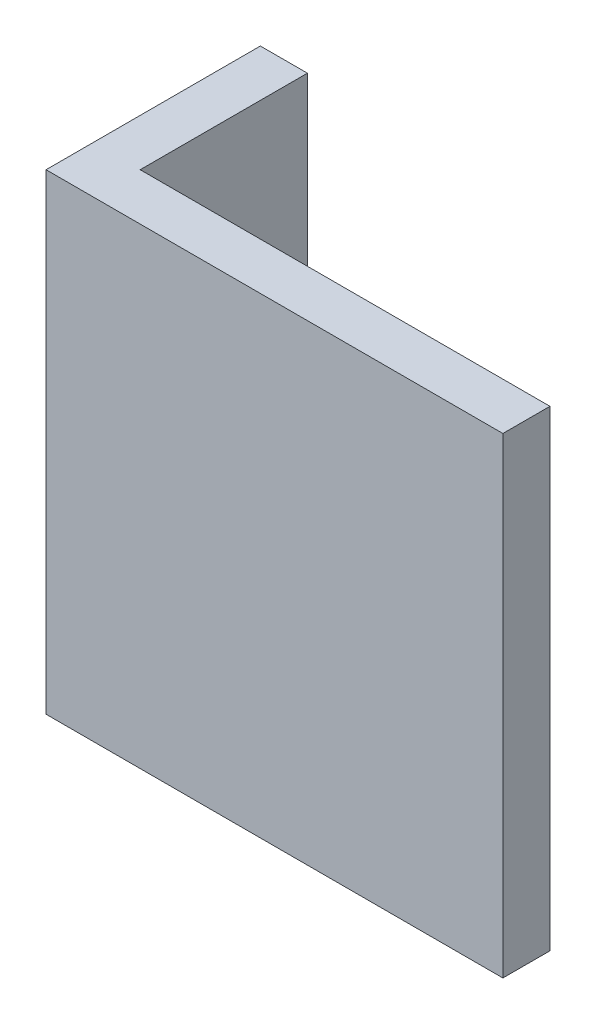
ISO-10303-21;
HEADER;
FILE_DESCRIPTION(('STEP AP214'),'2;1');
FILE_NAME('part.step','',(''),(''),'','','');
FILE_SCHEMA(('AUTOMOTIVE_DESIGN { 1 0 10303 214 1 1 1 1 }'));
ENDSEC;
DATA;
#1=APPLICATION_CONTEXT('core data for automotive mechanical design processes');
#2=APPLICATION_PROTOCOL_DEFINITION('international standard','automotive_design',2000,#1);
#3=PRODUCT_CONTEXT('',#1,'mechanical');
#4=PRODUCT('Part','Part','',(#3));
#5=PRODUCT_RELATED_PRODUCT_CATEGORY('part','',(#4));
#6=PRODUCT_DEFINITION_FORMATION('','',#4);
#7=PRODUCT_DEFINITION_CONTEXT('part definition',#1,'design');
#8=PRODUCT_DEFINITION('design','',#6,#7);
#9=PRODUCT_DEFINITION_SHAPE('','',#8);
#10=(LENGTH_UNIT() NAMED_UNIT(*) SI_UNIT(.MILLI.,.METRE.));
#11=(NAMED_UNIT(*) PLANE_ANGLE_UNIT() SI_UNIT($,.RADIAN.));
#12=(NAMED_UNIT(*) SI_UNIT($,.STERADIAN.) SOLID_ANGLE_UNIT());
#13=UNCERTAINTY_MEASURE_WITH_UNIT(LENGTH_MEASURE(1.E-05),#10,'distance_accuracy_value','');
#14=(GEOMETRIC_REPRESENTATION_CONTEXT(3) GLOBAL_UNCERTAINTY_ASSIGNED_CONTEXT((#13)) GLOBAL_UNIT_ASSIGNED_CONTEXT((#10,
#11,#12)) REPRESENTATION_CONTEXT('',''));
#15=CARTESIAN_POINT('',(0.,0.,0.));
#16=DIRECTION('',(0.,0.,1.));
#17=DIRECTION('',(1.,0.,0.));
#18=AXIS2_PLACEMENT_3D('',#15,#16,#17);
#19=CARTESIAN_POINT('',(-2.75510727911479,30.06,8.58850832049055));
#20=DIRECTION('',(0.,0.,1.));
#21=DIRECTION('',(1.,0.,0.));
#22=AXIS2_PLACEMENT_3D('',#19,#20,#21);
#23=PLANE('',#22);
#24=DIRECTION('',(-1.,0.,0.));
#25=VECTOR('',#24,1.);
#26=CARTESIAN_POINT('',(-2.75510727911479,0.,8.58850832049055));
#27=LINE('',#26,#25);
#28=CARTESIAN_POINT('',(0.244892720885212,0.,8.58850832049055));
#29=VERTEX_POINT('',#28);
#30=CARTESIAN_POINT('',(-2.75510727911479,0.,8.58850832049055));
#31=VERTEX_POINT('',#30);
#32=EDGE_CURVE('E128',#29,#31,#27,.T.);
#33=ORIENTED_EDGE('',*,*,#32,.T.);
#34=DIRECTION('',(0.,-1.,0.));
#35=VECTOR('',#34,1.);
#36=CARTESIAN_POINT('',(-2.75510727911479,30.06,8.58850832049055));
#37=LINE('',#36,#35);
#38=CARTESIAN_POINT('',(-2.75510727911479,30.06,8.58850832049055));
#39=VERTEX_POINT('',#38);
#40=EDGE_CURVE('E11',#39,#31,#37,.T.);
#41=ORIENTED_EDGE('',*,*,#40,.F.);
#42=DIRECTION('',(-1.,0.,0.));
#43=VECTOR('',#42,1.);
#44=CARTESIAN_POINT('',(-2.75510727911479,30.06,8.58850832049055));
#45=LINE('',#44,#43);
#46=CARTESIAN_POINT('',(0.244892720885212,30.06,8.58850832049055));
#47=VERTEX_POINT('',#46);
#48=EDGE_CURVE('E144',#47,#39,#45,.T.);
#49=ORIENTED_EDGE('',*,*,#48,.F.);
#50=DIRECTION('',(0.,-1.,0.));
#51=VECTOR('',#50,1.);
#52=CARTESIAN_POINT('',(0.244892720885212,30.06,8.58850832049055));
#53=LINE('',#52,#51);
#54=EDGE_CURVE('E124',#47,#29,#53,.T.);
#55=ORIENTED_EDGE('',*,*,#54,.T.);
#56=EDGE_LOOP('',(#33,#41,#49,#55));
#57=FACE_BOUND('',#56,.T.);
#58=ADVANCED_FACE('F39',(#57),#23,.F.);
#59=CARTESIAN_POINT('',(-2.75510727911479,30.06,8.58850832049055));
#60=DIRECTION('',(1.,0.,0.));
#61=DIRECTION('',(0.,0.,-1.));
#62=AXIS2_PLACEMENT_3D('',#59,#60,#61);
#63=PLANE('',#62);
#64=DIRECTION('',(0.,0.,1.));
#65=VECTOR('',#64,1.);
#66=CARTESIAN_POINT('',(-2.75510727911479,0.,8.58850832049055));
#67=LINE('',#66,#65);
#68=CARTESIAN_POINT('',(-2.75510727911479,0.,22.2485083204905));
#69=VERTEX_POINT('',#68);
#70=EDGE_CURVE('E132',#31,#69,#67,.T.);
#71=ORIENTED_EDGE('',*,*,#70,.T.);
#72=DIRECTION('',(0.,-1.,0.));
#73=VECTOR('',#72,1.);
#74=CARTESIAN_POINT('',(-2.75510727911479,30.06,22.2485083204905));
#75=LINE('',#74,#73);
#76=CARTESIAN_POINT('',(-2.75510727911479,30.06,22.2485083204905));
#77=VERTEX_POINT('',#76);
#78=EDGE_CURVE('E48',#77,#69,#75,.T.);
#79=ORIENTED_EDGE('',*,*,#78,.F.);
#80=DIRECTION('',(0.,0.,1.));
#81=VECTOR('',#80,1.);
#82=CARTESIAN_POINT('',(-2.75510727911479,30.06,8.58850832049055));
#83=LINE('',#82,#81);
#84=EDGE_CURVE('E93',#39,#77,#83,.T.);
#85=ORIENTED_EDGE('',*,*,#84,.F.);
#86=ORIENTED_EDGE('',*,*,#40,.T.);
#87=EDGE_LOOP('',(#71,#79,#85,#86));
#88=FACE_BOUND('',#87,.T.);
#89=ADVANCED_FACE('F172',(#88),#63,.F.);
#90=CARTESIAN_POINT('',(-2.75510727911479,30.06,22.2485083204905));
#91=DIRECTION('',(0.,0.,-1.));
#92=DIRECTION('',(-1.,0.,0.));
#93=AXIS2_PLACEMENT_3D('',#90,#91,#92);
#94=PLANE('',#93);
#95=DIRECTION('',(1.,0.,0.));
#96=VECTOR('',#95,1.);
#97=CARTESIAN_POINT('',(-2.75510727911479,0.,22.2485083204905));
#98=LINE('',#97,#96);
#99=CARTESIAN_POINT('',(26.3648927208852,0.,22.2485083204905));
#100=VERTEX_POINT('',#99);
#101=EDGE_CURVE('E135',#69,#100,#98,.T.);
#102=ORIENTED_EDGE('',*,*,#101,.T.);
#103=DIRECTION('',(0.,-1.,0.));
#104=VECTOR('',#103,1.);
#105=CARTESIAN_POINT('',(26.3648927208852,30.06,22.2485083204905));
#106=LINE('',#105,#104);
#107=CARTESIAN_POINT('',(26.3648927208852,30.06,22.2485083204905));
#108=VERTEX_POINT('',#107);
#109=EDGE_CURVE('E117',#108,#100,#106,.T.);
#110=ORIENTED_EDGE('',*,*,#109,.F.);
#111=DIRECTION('',(1.,0.,0.));
#112=VECTOR('',#111,1.);
#113=CARTESIAN_POINT('',(-2.75510727911479,30.06,22.2485083204905));
#114=LINE('',#113,#112);
#115=EDGE_CURVE('E106',#77,#108,#114,.T.);
#116=ORIENTED_EDGE('',*,*,#115,.F.);
#117=ORIENTED_EDGE('',*,*,#78,.T.);
#118=EDGE_LOOP('',(#102,#110,#116,#117));
#119=FACE_BOUND('',#118,.T.);
#120=ADVANCED_FACE('F154',(#119),#94,.F.);
#121=CARTESIAN_POINT('',(26.3648927208852,30.06,19.2485083204905));
#122=DIRECTION('',(-1.,0.,0.));
#123=DIRECTION('',(0.,0.,1.));
#124=AXIS2_PLACEMENT_3D('',#121,#122,#123);
#125=PLANE('',#124);
#126=DIRECTION('',(0.,0.,-1.));
#127=VECTOR('',#126,1.);
#128=CARTESIAN_POINT('',(26.3648927208852,0.,19.2485083204905));
#129=LINE('',#128,#127);
#130=CARTESIAN_POINT('',(26.3648927208852,0.,19.2485083204905));
#131=VERTEX_POINT('',#130);
#132=EDGE_CURVE('E115',#100,#131,#129,.T.);
#133=ORIENTED_EDGE('',*,*,#132,.T.);
#134=DIRECTION('',(0.,-1.,0.));
#135=VECTOR('',#134,1.);
#136=CARTESIAN_POINT('',(26.3648927208852,30.06,19.2485083204905));
#137=LINE('',#136,#135);
#138=CARTESIAN_POINT('',(26.3648927208852,30.06,19.2485083204905));
#139=VERTEX_POINT('',#138);
#140=EDGE_CURVE('E112',#139,#131,#137,.T.);
#141=ORIENTED_EDGE('',*,*,#140,.F.);
#142=DIRECTION('',(0.,0.,-1.));
#143=VECTOR('',#142,1.);
#144=CARTESIAN_POINT('',(26.3648927208852,30.06,19.2485083204905));
#145=LINE('',#144,#143);
#146=EDGE_CURVE('E100',#108,#139,#145,.T.);
#147=ORIENTED_EDGE('',*,*,#146,.F.);
#148=ORIENTED_EDGE('',*,*,#109,.T.);
#149=EDGE_LOOP('',(#133,#141,#147,#148));
#150=FACE_BOUND('',#149,.T.);
#151=ADVANCED_FACE('F113',(#150),#125,.F.);
#152=CARTESIAN_POINT('',(0.244892720885214,30.06,19.2485083204905));
#153=DIRECTION('',(0.,0.,1.));
#154=DIRECTION('',(1.,0.,0.));
#155=AXIS2_PLACEMENT_3D('',#152,#153,#154);
#156=PLANE('',#155);
#157=DIRECTION('',(-1.,0.,0.));
#158=VECTOR('',#157,1.);
#159=CARTESIAN_POINT('',(0.244892720885214,0.,19.2485083204905));
#160=LINE('',#159,#158);
#161=CARTESIAN_POINT('',(0.244892720885214,0.,19.2485083204905));
#162=VERTEX_POINT('',#161);
#163=EDGE_CURVE('E79',#131,#162,#160,.T.);
#164=ORIENTED_EDGE('',*,*,#163,.T.);
#165=DIRECTION('',(0.,-1.,0.));
#166=VECTOR('',#165,1.);
#167=CARTESIAN_POINT('',(0.244892720885214,30.06,19.2485083204905));
#168=LINE('',#167,#166);
#169=CARTESIAN_POINT('',(0.244892720885214,30.06,19.2485083204905));
#170=VERTEX_POINT('',#169);
#171=EDGE_CURVE('E118',#170,#162,#168,.T.);
#172=ORIENTED_EDGE('',*,*,#171,.F.);
#173=DIRECTION('',(-1.,0.,0.));
#174=VECTOR('',#173,1.);
#175=CARTESIAN_POINT('',(0.244892720885214,30.06,19.2485083204905));
#176=LINE('',#175,#174);
#177=EDGE_CURVE('E104',#139,#170,#176,.T.);
#178=ORIENTED_EDGE('',*,*,#177,.F.);
#179=ORIENTED_EDGE('',*,*,#140,.T.);
#180=EDGE_LOOP('',(#164,#172,#178,#179));
#181=FACE_BOUND('',#180,.T.);
#182=ADVANCED_FACE('F120',(#181),#156,.F.);
#183=CARTESIAN_POINT('',(0.244892720885212,30.06,8.58850832049055));
#184=DIRECTION('',(-1.,0.,0.));
#185=DIRECTION('',(0.,0.,1.));
#186=AXIS2_PLACEMENT_3D('',#183,#184,#185);
#187=PLANE('',#186);
#188=DIRECTION('',(0.,0.,-1.));
#189=VECTOR('',#188,1.);
#190=CARTESIAN_POINT('',(0.244892720885212,0.,8.58850832049055));
#191=LINE('',#190,#189);
#192=EDGE_CURVE('E85',#162,#29,#191,.T.);
#193=ORIENTED_EDGE('',*,*,#192,.T.);
#194=ORIENTED_EDGE('',*,*,#54,.F.);
#195=DIRECTION('',(0.,0.,-1.));
#196=VECTOR('',#195,1.);
#197=CARTESIAN_POINT('',(0.244892720885212,30.06,8.58850832049055));
#198=LINE('',#197,#196);
#199=EDGE_CURVE('E56',#170,#47,#198,.T.);
#200=ORIENTED_EDGE('',*,*,#199,.F.);
#201=ORIENTED_EDGE('',*,*,#171,.T.);
#202=EDGE_LOOP('',(#193,#194,#200,#201));
#203=FACE_BOUND('',#202,.T.);
#204=ADVANCED_FACE('F161',(#203),#187,.F.);
#205=CARTESIAN_POINT('',(0.,30.06,0.));
#206=DIRECTION('',(0.,-1.,0.));
#207=DIRECTION('',(0.,0.,-1.));
#208=AXIS2_PLACEMENT_3D('',#205,#206,#207);
#209=PLANE('',#208);
#210=ORIENTED_EDGE('',*,*,#48,.T.);
#211=ORIENTED_EDGE('',*,*,#84,.T.);
#212=ORIENTED_EDGE('',*,*,#115,.T.);
#213=ORIENTED_EDGE('',*,*,#146,.T.);
#214=ORIENTED_EDGE('',*,*,#177,.T.);
#215=ORIENTED_EDGE('',*,*,#199,.T.);
#216=EDGE_LOOP('',(#210,#211,#212,#213,#214,#215));
#217=FACE_BOUND('',#216,.T.);
#218=ADVANCED_FACE('F102',(#217),#209,.F.);
#219=CARTESIAN_POINT('',(0.,0.,0.));
#220=DIRECTION('',(0.,-1.,0.));
#221=DIRECTION('',(0.,0.,-1.));
#222=AXIS2_PLACEMENT_3D('',#219,#220,#221);
#223=PLANE('',#222);
#224=ORIENTED_EDGE('',*,*,#32,.F.);
#225=ORIENTED_EDGE('',*,*,#192,.F.);
#226=ORIENTED_EDGE('',*,*,#163,.F.);
#227=ORIENTED_EDGE('',*,*,#132,.F.);
#228=ORIENTED_EDGE('',*,*,#101,.F.);
#229=ORIENTED_EDGE('',*,*,#70,.F.);
#230=EDGE_LOOP('',(#224,#225,#226,#227,#228,#229));
#231=FACE_BOUND('',#230,.T.);
#232=ADVANCED_FACE('F157',(#231),#223,.T.);
#233=CLOSED_SHELL('',(#58,#89,#120,#151,#182,#204,#218,#232));
#234=MANIFOLD_SOLID_BREP('B2',#233);
#235=ADVANCED_BREP_SHAPE_REPRESENTATION('',(#18,#234),#14);
#236=SHAPE_DEFINITION_REPRESENTATION(#9,#235);
ENDSEC;
END-ISO-10303-21;
